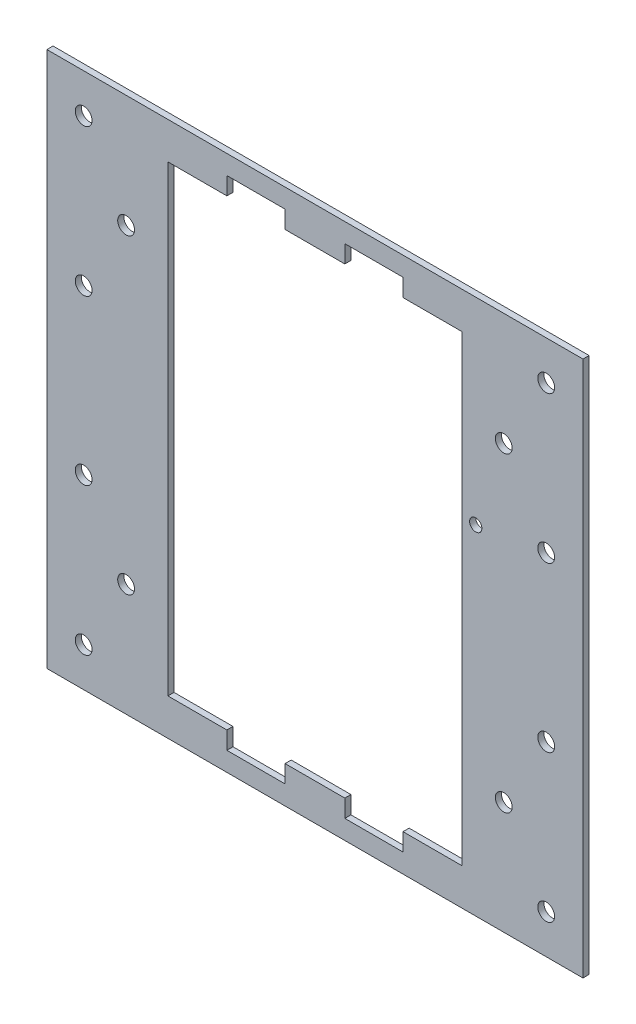
ISO-10303-21;
HEADER;
FILE_DESCRIPTION(('STEP AP214'),'2;1');
FILE_NAME('part.step','',(''),(''),'','','');
FILE_SCHEMA(('AUTOMOTIVE_DESIGN { 1 0 10303 214 1 1 1 1 }'));
ENDSEC;
DATA;
#1=APPLICATION_CONTEXT('core data for automotive mechanical design processes');
#2=APPLICATION_PROTOCOL_DEFINITION('international standard','automotive_design',2000,#1);
#3=PRODUCT_CONTEXT('',#1,'mechanical');
#4=PRODUCT('Part','Part','',(#3));
#5=PRODUCT_RELATED_PRODUCT_CATEGORY('part','',(#4));
#6=PRODUCT_DEFINITION_FORMATION('','',#4);
#7=PRODUCT_DEFINITION_CONTEXT('part definition',#1,'design');
#8=PRODUCT_DEFINITION('design','',#6,#7);
#9=PRODUCT_DEFINITION_SHAPE('','',#8);
#10=(LENGTH_UNIT() NAMED_UNIT(*) SI_UNIT(.MILLI.,.METRE.));
#11=(NAMED_UNIT(*) PLANE_ANGLE_UNIT() SI_UNIT($,.RADIAN.));
#12=(NAMED_UNIT(*) SI_UNIT($,.STERADIAN.) SOLID_ANGLE_UNIT());
#13=UNCERTAINTY_MEASURE_WITH_UNIT(LENGTH_MEASURE(1.E-05),#10,'distance_accuracy_value','');
#14=(GEOMETRIC_REPRESENTATION_CONTEXT(3) GLOBAL_UNCERTAINTY_ASSIGNED_CONTEXT((#13)) GLOBAL_UNIT_ASSIGNED_CONTEXT((#10,
#11,#12)) REPRESENTATION_CONTEXT('',''));
#15=CARTESIAN_POINT('',(0.,0.,0.));
#16=DIRECTION('',(0.,0.,1.));
#17=DIRECTION('',(1.,0.,0.));
#18=AXIS2_PLACEMENT_3D('',#15,#16,#17);
#19=CARTESIAN_POINT('',(0.,700.,8.));
#20=DIRECTION('',(1.,0.,0.));
#21=DIRECTION('',(0.,0.,-1.));
#22=AXIS2_PLACEMENT_3D('',#19,#20,#21);
#23=PLANE('',#22);
#24=DIRECTION('',(0.,-1.,0.));
#25=VECTOR('',#24,1.);
#26=CARTESIAN_POINT('',(0.,700.,0.));
#27=LINE('',#26,#25);
#28=CARTESIAN_POINT('',(0.,700.,0.));
#29=VERTEX_POINT('',#28);
#30=CARTESIAN_POINT('',(0.,0.,0.));
#31=VERTEX_POINT('',#30);
#32=EDGE_CURVE('E422',#29,#31,#27,.T.);
#33=ORIENTED_EDGE('',*,*,#32,.T.);
#34=DIRECTION('',(0.,0.,-1.));
#35=VECTOR('',#34,1.);
#36=CARTESIAN_POINT('',(0.,0.,8.));
#37=LINE('',#36,#35);
#38=CARTESIAN_POINT('',(0.,0.,8.));
#39=VERTEX_POINT('',#38);
#40=EDGE_CURVE('E451',#39,#31,#37,.T.);
#41=ORIENTED_EDGE('',*,*,#40,.F.);
#42=DIRECTION('',(0.,-1.,0.));
#43=VECTOR('',#42,1.);
#44=CARTESIAN_POINT('',(0.,700.,8.));
#45=LINE('',#44,#43);
#46=CARTESIAN_POINT('',(0.,700.,8.));
#47=VERTEX_POINT('',#46);
#48=EDGE_CURVE('E425',#47,#39,#45,.T.);
#49=ORIENTED_EDGE('',*,*,#48,.F.);
#50=DIRECTION('',(0.,0.,-1.));
#51=VECTOR('',#50,1.);
#52=CARTESIAN_POINT('',(0.,700.,8.));
#53=LINE('',#52,#51);
#54=EDGE_CURVE('E435',#47,#29,#53,.T.);
#55=ORIENTED_EDGE('',*,*,#54,.T.);
#56=EDGE_LOOP('',(#33,#41,#49,#55));
#57=FACE_BOUND('',#56,.T.);
#58=ADVANCED_FACE('F39',(#57),#23,.F.);
#59=CARTESIAN_POINT('',(0.,0.,8.));
#60=DIRECTION('',(0.,1.,0.));
#61=DIRECTION('',(0.,0.,1.));
#62=AXIS2_PLACEMENT_3D('',#59,#60,#61);
#63=PLANE('',#62);
#64=DIRECTION('',(1.,0.,0.));
#65=VECTOR('',#64,1.);
#66=CARTESIAN_POINT('',(0.,0.,0.));
#67=LINE('',#66,#65);
#68=CARTESIAN_POINT('',(700.,0.,0.));
#69=VERTEX_POINT('',#68);
#70=EDGE_CURVE('E438',#31,#69,#67,.T.);
#71=ORIENTED_EDGE('',*,*,#70,.T.);
#72=DIRECTION('',(0.,0.,-1.));
#73=VECTOR('',#72,1.);
#74=CARTESIAN_POINT('',(700.,0.,8.));
#75=LINE('',#74,#73);
#76=CARTESIAN_POINT('',(700.,0.,8.));
#77=VERTEX_POINT('',#76);
#78=EDGE_CURVE('E448',#77,#69,#75,.T.);
#79=ORIENTED_EDGE('',*,*,#78,.F.);
#80=DIRECTION('',(1.,0.,0.));
#81=VECTOR('',#80,1.);
#82=CARTESIAN_POINT('',(0.,0.,8.));
#83=LINE('',#82,#81);
#84=EDGE_CURVE('E428',#39,#77,#83,.T.);
#85=ORIENTED_EDGE('',*,*,#84,.F.);
#86=ORIENTED_EDGE('',*,*,#40,.T.);
#87=EDGE_LOOP('',(#71,#79,#85,#86));
#88=FACE_BOUND('',#87,.T.);
#89=ADVANCED_FACE('F519',(#88),#63,.F.);
#90=CARTESIAN_POINT('',(700.,0.,8.));
#91=DIRECTION('',(-1.,0.,0.));
#92=DIRECTION('',(0.,0.,1.));
#93=AXIS2_PLACEMENT_3D('',#90,#91,#92);
#94=PLANE('',#93);
#95=DIRECTION('',(0.,1.,0.));
#96=VECTOR('',#95,1.);
#97=CARTESIAN_POINT('',(700.,0.,0.));
#98=LINE('',#97,#96);
#99=CARTESIAN_POINT('',(700.,700.,0.));
#100=VERTEX_POINT('',#99);
#101=EDGE_CURVE('E440',#69,#100,#98,.T.);
#102=ORIENTED_EDGE('',*,*,#101,.T.);
#103=DIRECTION('',(0.,0.,-1.));
#104=VECTOR('',#103,1.);
#105=CARTESIAN_POINT('',(700.,700.,8.));
#106=LINE('',#105,#104);
#107=CARTESIAN_POINT('',(700.,700.,8.));
#108=VERTEX_POINT('',#107);
#109=EDGE_CURVE('E445',#108,#100,#106,.T.);
#110=ORIENTED_EDGE('',*,*,#109,.F.);
#111=DIRECTION('',(0.,1.,0.));
#112=VECTOR('',#111,1.);
#113=CARTESIAN_POINT('',(700.,0.,8.));
#114=LINE('',#113,#112);
#115=EDGE_CURVE('E431',#77,#108,#114,.T.);
#116=ORIENTED_EDGE('',*,*,#115,.F.);
#117=ORIENTED_EDGE('',*,*,#78,.T.);
#118=EDGE_LOOP('',(#102,#110,#116,#117));
#119=FACE_BOUND('',#118,.T.);
#120=ADVANCED_FACE('F524',(#119),#94,.F.);
#121=CARTESIAN_POINT('',(700.,700.,8.));
#122=DIRECTION('',(0.,-1.,0.));
#123=DIRECTION('',(0.,0.,-1.));
#124=AXIS2_PLACEMENT_3D('',#121,#122,#123);
#125=PLANE('',#124);
#126=DIRECTION('',(-1.,0.,0.));
#127=VECTOR('',#126,1.);
#128=CARTESIAN_POINT('',(700.,700.,0.));
#129=LINE('',#128,#127);
#130=EDGE_CURVE('E429',#100,#29,#129,.T.);
#131=ORIENTED_EDGE('',*,*,#130,.T.);
#132=ORIENTED_EDGE('',*,*,#54,.F.);
#133=DIRECTION('',(-1.,0.,0.));
#134=VECTOR('',#133,1.);
#135=CARTESIAN_POINT('',(700.,700.,8.));
#136=LINE('',#135,#134);
#137=EDGE_CURVE('E433',#108,#47,#136,.T.);
#138=ORIENTED_EDGE('',*,*,#137,.F.);
#139=ORIENTED_EDGE('',*,*,#109,.T.);
#140=EDGE_LOOP('',(#131,#132,#138,#139));
#141=FACE_BOUND('',#140,.T.);
#142=ADVANCED_FACE('F538',(#141),#125,.F.);
#143=CARTESIAN_POINT('',(0.,0.,8.));
#144=DIRECTION('',(0.,0.,1.));
#145=DIRECTION('',(1.,0.,0.));
#146=AXIS2_PLACEMENT_3D('',#143,#144,#145);
#147=PLANE('',#146);
#148=CARTESIAN_POINT('',(560.,442.45,8.));
#149=DIRECTION('',(0.,0.,1.));
#150=DIRECTION('',(1.,0.,0.));
#151=AXIS2_PLACEMENT_3D('',#148,#149,#150);
#152=CIRCLE('',#151,8.00000000000001);
#153=CARTESIAN_POINT('',(568.,442.45,8.));
#154=VERTEX_POINT('',#153);
#155=EDGE_CURVE('E234',#154,#154,#152,.T.);
#156=ORIENTED_EDGE('',*,*,#155,.F.);
#157=EDGE_LOOP('',(#156));
#158=FACE_BOUND('',#157,.T.);
#159=DIRECTION('',(-1.,0.,0.));
#160=VECTOR('',#159,1.);
#161=CARTESIAN_POINT('',(542.,652.,8.));
#162=LINE('',#161,#160);
#163=CARTESIAN_POINT('',(389.,652.,8.));
#164=VERTEX_POINT('',#163);
#165=CARTESIAN_POINT('',(311.,652.,8.));
#166=VERTEX_POINT('',#165);
#167=EDGE_CURVE('E230',#164,#166,#162,.T.);
#168=ORIENTED_EDGE('',*,*,#167,.F.);
#169=DIRECTION('',(0.,-1.,0.));
#170=VECTOR('',#169,1.);
#171=CARTESIAN_POINT('',(389.,675.,8.));
#172=LINE('',#171,#170);
#173=CARTESIAN_POINT('',(389.,675.,8.));
#174=VERTEX_POINT('',#173);
#175=EDGE_CURVE('E340',#174,#164,#172,.T.);
#176=ORIENTED_EDGE('',*,*,#175,.F.);
#177=DIRECTION('',(-1.,0.,0.));
#178=VECTOR('',#177,1.);
#179=CARTESIAN_POINT('',(465.,675.,8.));
#180=LINE('',#179,#178);
#181=CARTESIAN_POINT('',(465.,675.,8.));
#182=VERTEX_POINT('',#181);
#183=EDGE_CURVE('E346',#182,#174,#180,.T.);
#184=ORIENTED_EDGE('',*,*,#183,.F.);
#185=DIRECTION('',(0.,1.,0.));
#186=VECTOR('',#185,1.);
#187=CARTESIAN_POINT('',(465.,375.,8.));
#188=LINE('',#187,#186);
#189=CARTESIAN_POINT('',(465.,652.,8.));
#190=VERTEX_POINT('',#189);
#191=EDGE_CURVE('E354',#190,#182,#188,.T.);
#192=ORIENTED_EDGE('',*,*,#191,.F.);
#193=CARTESIAN_POINT('',(542.,652.,8.));
#194=VERTEX_POINT('',#193);
#195=EDGE_CURVE('E227',#194,#190,#162,.T.);
#196=ORIENTED_EDGE('',*,*,#195,.F.);
#197=DIRECTION('',(0.,1.,0.));
#198=VECTOR('',#197,1.);
#199=CARTESIAN_POINT('',(542.,48.,8.));
#200=LINE('',#199,#198);
#201=CARTESIAN_POINT('',(542.,48.,8.));
#202=VERTEX_POINT('',#201);
#203=EDGE_CURVE('E247',#202,#194,#200,.T.);
#204=ORIENTED_EDGE('',*,*,#203,.F.);
#205=DIRECTION('',(1.,0.,0.));
#206=VECTOR('',#205,1.);
#207=CARTESIAN_POINT('',(158.,48.,8.));
#208=LINE('',#207,#206);
#209=CARTESIAN_POINT('',(465.,48.,8.));
#210=VERTEX_POINT('',#209);
#211=EDGE_CURVE('E243',#210,#202,#208,.T.);
#212=ORIENTED_EDGE('',*,*,#211,.F.);
#213=DIRECTION('',(0.,1.,0.));
#214=VECTOR('',#213,1.);
#215=CARTESIAN_POINT('',(465.,25.,8.));
#216=LINE('',#215,#214);
#217=CARTESIAN_POINT('',(465.,25.,8.));
#218=VERTEX_POINT('',#217);
#219=EDGE_CURVE('E366',#218,#210,#216,.T.);
#220=ORIENTED_EDGE('',*,*,#219,.F.);
#221=DIRECTION('',(1.,0.,0.));
#222=VECTOR('',#221,1.);
#223=CARTESIAN_POINT('',(389.,25.,8.));
#224=LINE('',#223,#222);
#225=CARTESIAN_POINT('',(389.,25.,8.));
#226=VERTEX_POINT('',#225);
#227=EDGE_CURVE('E374',#226,#218,#224,.T.);
#228=ORIENTED_EDGE('',*,*,#227,.F.);
#229=DIRECTION('',(0.,-1.,0.));
#230=VECTOR('',#229,1.);
#231=CARTESIAN_POINT('',(389.,325.,8.));
#232=LINE('',#231,#230);
#233=CARTESIAN_POINT('',(389.,48.,8.));
#234=VERTEX_POINT('',#233);
#235=EDGE_CURVE('E360',#234,#226,#232,.T.);
#236=ORIENTED_EDGE('',*,*,#235,.F.);
#237=CARTESIAN_POINT('',(311.,48.,8.));
#238=VERTEX_POINT('',#237);
#239=EDGE_CURVE('E61',#238,#234,#208,.T.);
#240=ORIENTED_EDGE('',*,*,#239,.F.);
#241=DIRECTION('',(0.,1.,0.));
#242=VECTOR('',#241,1.);
#243=CARTESIAN_POINT('',(311.,25.,8.));
#244=LINE('',#243,#242);
#245=CARTESIAN_POINT('',(311.,25.,8.));
#246=VERTEX_POINT('',#245);
#247=EDGE_CURVE('E407',#246,#238,#244,.T.);
#248=ORIENTED_EDGE('',*,*,#247,.F.);
#249=DIRECTION('',(1.,0.,0.));
#250=VECTOR('',#249,1.);
#251=CARTESIAN_POINT('',(235.,25.,8.));
#252=LINE('',#251,#250);
#253=CARTESIAN_POINT('',(235.,25.,8.));
#254=VERTEX_POINT('',#253);
#255=EDGE_CURVE('E415',#254,#246,#252,.T.);
#256=ORIENTED_EDGE('',*,*,#255,.F.);
#257=DIRECTION('',(0.,-1.,0.));
#258=VECTOR('',#257,1.);
#259=CARTESIAN_POINT('',(235.,325.,8.));
#260=LINE('',#259,#258);
#261=CARTESIAN_POINT('',(235.,48.,8.));
#262=VERTEX_POINT('',#261);
#263=EDGE_CURVE('E401',#262,#254,#260,.T.);
#264=ORIENTED_EDGE('',*,*,#263,.F.);
#265=CARTESIAN_POINT('',(158.,48.,8.));
#266=VERTEX_POINT('',#265);
#267=EDGE_CURVE('E245',#266,#262,#208,.T.);
#268=ORIENTED_EDGE('',*,*,#267,.F.);
#269=DIRECTION('',(0.,-1.,0.));
#270=VECTOR('',#269,1.);
#271=CARTESIAN_POINT('',(158.,652.,8.));
#272=LINE('',#271,#270);
#273=CARTESIAN_POINT('',(158.,652.,8.));
#274=VERTEX_POINT('',#273);
#275=EDGE_CURVE('E206',#274,#266,#272,.T.);
#276=ORIENTED_EDGE('',*,*,#275,.F.);
#277=CARTESIAN_POINT('',(235.,652.,8.));
#278=VERTEX_POINT('',#277);
#279=EDGE_CURVE('E232',#278,#274,#162,.T.);
#280=ORIENTED_EDGE('',*,*,#279,.F.);
#281=DIRECTION('',(0.,-1.,0.));
#282=VECTOR('',#281,1.);
#283=CARTESIAN_POINT('',(235.,675.,8.));
#284=LINE('',#283,#282);
#285=CARTESIAN_POINT('',(235.,675.,8.));
#286=VERTEX_POINT('',#285);
#287=EDGE_CURVE('E381',#286,#278,#284,.T.);
#288=ORIENTED_EDGE('',*,*,#287,.F.);
#289=DIRECTION('',(-1.,0.,0.));
#290=VECTOR('',#289,1.);
#291=CARTESIAN_POINT('',(311.,675.,8.));
#292=LINE('',#291,#290);
#293=CARTESIAN_POINT('',(311.,675.,8.));
#294=VERTEX_POINT('',#293);
#295=EDGE_CURVE('E387',#294,#286,#292,.T.);
#296=ORIENTED_EDGE('',*,*,#295,.F.);
#297=DIRECTION('',(0.,1.,0.));
#298=VECTOR('',#297,1.);
#299=CARTESIAN_POINT('',(311.,375.,8.));
#300=LINE('',#299,#298);
#301=EDGE_CURVE('E395',#166,#294,#300,.T.);
#302=ORIENTED_EDGE('',*,*,#301,.F.);
#303=EDGE_LOOP('',(#168,#176,#184,#192,#196,#204,#212,#220,#228,#236,#240,#248,#256,#264,#268,
#276,#280,#288,#296,#302));
#304=FACE_BOUND('',#303,.T.);
#305=CARTESIAN_POINT('',(596.57,553.,8.));
#306=DIRECTION('',(0.,0.,1.));
#307=DIRECTION('',(1.,0.,0.));
#308=AXIS2_PLACEMENT_3D('',#305,#306,#307);
#309=CIRCLE('',#308,11.);
#310=CARTESIAN_POINT('',(607.57,553.,8.));
#311=VERTEX_POINT('',#310);
#312=EDGE_CURVE('E270',#311,#311,#309,.T.);
#313=ORIENTED_EDGE('',*,*,#312,.F.);
#314=EDGE_LOOP('',(#313));
#315=FACE_BOUND('',#314,.T.);
#316=CARTESIAN_POINT('',(596.57,147.,8.));
#317=DIRECTION('',(0.,0.,1.));
#318=DIRECTION('',(1.,0.,0.));
#319=AXIS2_PLACEMENT_3D('',#316,#317,#318);
#320=CIRCLE('',#319,11.);
#321=CARTESIAN_POINT('',(607.57,147.,8.));
#322=VERTEX_POINT('',#321);
#323=EDGE_CURVE('E274',#322,#322,#320,.T.);
#324=ORIENTED_EDGE('',*,*,#323,.F.);
#325=EDGE_LOOP('',(#324));
#326=FACE_BOUND('',#325,.T.);
#327=CARTESIAN_POINT('',(652.,649.,8.));
#328=DIRECTION('',(0.,0.,1.));
#329=DIRECTION('',(1.,0.,0.));
#330=AXIS2_PLACEMENT_3D('',#327,#328,#329);
#331=CIRCLE('',#330,11.);
#332=CARTESIAN_POINT('',(663.,649.,8.));
#333=VERTEX_POINT('',#332);
#334=EDGE_CURVE('E280',#333,#333,#331,.T.);
#335=ORIENTED_EDGE('',*,*,#334,.F.);
#336=EDGE_LOOP('',(#335));
#337=FACE_BOUND('',#336,.T.);
#338=CARTESIAN_POINT('',(652.,457.,8.));
#339=DIRECTION('',(0.,0.,1.));
#340=DIRECTION('',(1.,0.,0.));
#341=AXIS2_PLACEMENT_3D('',#338,#339,#340);
#342=CIRCLE('',#341,11.);
#343=CARTESIAN_POINT('',(663.,457.,8.));
#344=VERTEX_POINT('',#343);
#345=EDGE_CURVE('E286',#344,#344,#342,.T.);
#346=ORIENTED_EDGE('',*,*,#345,.F.);
#347=EDGE_LOOP('',(#346));
#348=FACE_BOUND('',#347,.T.);
#349=CARTESIAN_POINT('',(652.,243.,8.));
#350=DIRECTION('',(0.,0.,1.));
#351=DIRECTION('',(1.,0.,0.));
#352=AXIS2_PLACEMENT_3D('',#349,#350,#351);
#353=CIRCLE('',#352,11.);
#354=CARTESIAN_POINT('',(663.,243.,8.));
#355=VERTEX_POINT('',#354);
#356=EDGE_CURVE('E292',#355,#355,#353,.T.);
#357=ORIENTED_EDGE('',*,*,#356,.F.);
#358=EDGE_LOOP('',(#357));
#359=FACE_BOUND('',#358,.T.);
#360=CARTESIAN_POINT('',(652.,51.,8.));
#361=DIRECTION('',(0.,0.,1.));
#362=DIRECTION('',(1.,0.,0.));
#363=AXIS2_PLACEMENT_3D('',#360,#361,#362);
#364=CIRCLE('',#363,11.);
#365=CARTESIAN_POINT('',(663.,51.,8.));
#366=VERTEX_POINT('',#365);
#367=EDGE_CURVE('E298',#366,#366,#364,.T.);
#368=ORIENTED_EDGE('',*,*,#367,.F.);
#369=EDGE_LOOP('',(#368));
#370=FACE_BOUND('',#369,.T.);
#371=CARTESIAN_POINT('',(103.43,553.,8.));
#372=DIRECTION('',(0.,0.,1.));
#373=DIRECTION('',(1.,0.,0.));
#374=AXIS2_PLACEMENT_3D('',#371,#372,#373);
#375=CIRCLE('',#374,11.);
#376=CARTESIAN_POINT('',(114.43,553.,8.));
#377=VERTEX_POINT('',#376);
#378=EDGE_CURVE('E304',#377,#377,#375,.T.);
#379=ORIENTED_EDGE('',*,*,#378,.F.);
#380=EDGE_LOOP('',(#379));
#381=FACE_BOUND('',#380,.T.);
#382=CARTESIAN_POINT('',(103.43,147.,8.));
#383=DIRECTION('',(0.,0.,1.));
#384=DIRECTION('',(1.,0.,0.));
#385=AXIS2_PLACEMENT_3D('',#382,#383,#384);
#386=CIRCLE('',#385,11.);
#387=CARTESIAN_POINT('',(114.43,147.,8.));
#388=VERTEX_POINT('',#387);
#389=EDGE_CURVE('E310',#388,#388,#386,.T.);
#390=ORIENTED_EDGE('',*,*,#389,.F.);
#391=EDGE_LOOP('',(#390));
#392=FACE_BOUND('',#391,.T.);
#393=CARTESIAN_POINT('',(48.,649.,8.));
#394=DIRECTION('',(0.,0.,1.));
#395=DIRECTION('',(1.,0.,0.));
#396=AXIS2_PLACEMENT_3D('',#393,#394,#395);
#397=CIRCLE('',#396,11.);
#398=CARTESIAN_POINT('',(59.,649.,8.));
#399=VERTEX_POINT('',#398);
#400=EDGE_CURVE('E316',#399,#399,#397,.T.);
#401=ORIENTED_EDGE('',*,*,#400,.F.);
#402=EDGE_LOOP('',(#401));
#403=FACE_BOUND('',#402,.T.);
#404=CARTESIAN_POINT('',(48.,457.,8.));
#405=DIRECTION('',(0.,0.,1.));
#406=DIRECTION('',(1.,0.,0.));
#407=AXIS2_PLACEMENT_3D('',#404,#405,#406);
#408=CIRCLE('',#407,11.);
#409=CARTESIAN_POINT('',(59.,457.,8.));
#410=VERTEX_POINT('',#409);
#411=EDGE_CURVE('E322',#410,#410,#408,.T.);
#412=ORIENTED_EDGE('',*,*,#411,.F.);
#413=EDGE_LOOP('',(#412));
#414=FACE_BOUND('',#413,.T.);
#415=CARTESIAN_POINT('',(48.,243.,8.));
#416=DIRECTION('',(0.,0.,1.));
#417=DIRECTION('',(1.,0.,0.));
#418=AXIS2_PLACEMENT_3D('',#415,#416,#417);
#419=CIRCLE('',#418,11.);
#420=CARTESIAN_POINT('',(59.,243.,8.));
#421=VERTEX_POINT('',#420);
#422=EDGE_CURVE('E328',#421,#421,#419,.T.);
#423=ORIENTED_EDGE('',*,*,#422,.F.);
#424=EDGE_LOOP('',(#423));
#425=FACE_BOUND('',#424,.T.);
#426=CARTESIAN_POINT('',(48.,51.,8.));
#427=DIRECTION('',(0.,0.,1.));
#428=DIRECTION('',(1.,0.,0.));
#429=AXIS2_PLACEMENT_3D('',#426,#427,#428);
#430=CIRCLE('',#429,11.);
#431=CARTESIAN_POINT('',(59.,51.,8.));
#432=VERTEX_POINT('',#431);
#433=EDGE_CURVE('E334',#432,#432,#430,.T.);
#434=ORIENTED_EDGE('',*,*,#433,.F.);
#435=EDGE_LOOP('',(#434));
#436=FACE_BOUND('',#435,.T.);
#437=ORIENTED_EDGE('',*,*,#48,.T.);
#438=ORIENTED_EDGE('',*,*,#84,.T.);
#439=ORIENTED_EDGE('',*,*,#115,.T.);
#440=ORIENTED_EDGE('',*,*,#137,.T.);
#441=EDGE_LOOP('',(#437,#438,#439,#440));
#442=FACE_BOUND('',#441,.T.);
#443=ADVANCED_FACE('F465',(#158,#304,#315,#326,#337,#348,#359,#370,#381,#392,#403,#414,#425,
#436,#442),#147,.T.);
#444=CARTESIAN_POINT('',(0.,0.,0.));
#445=DIRECTION('',(0.,0.,1.));
#446=DIRECTION('',(1.,0.,0.));
#447=AXIS2_PLACEMENT_3D('',#444,#445,#446);
#448=PLANE('',#447);
#449=CARTESIAN_POINT('',(560.,442.45,0.));
#450=DIRECTION('',(0.,0.,1.));
#451=DIRECTION('',(1.,0.,0.));
#452=AXIS2_PLACEMENT_3D('',#449,#450,#451);
#453=CIRCLE('',#452,8.00000000000001);
#454=CARTESIAN_POINT('',(568.,442.45,0.));
#455=VERTEX_POINT('',#454);
#456=EDGE_CURVE('E244',#455,#455,#453,.T.);
#457=ORIENTED_EDGE('',*,*,#456,.T.);
#458=EDGE_LOOP('',(#457));
#459=FACE_BOUND('',#458,.T.);
#460=CARTESIAN_POINT('',(596.57,553.,0.));
#461=DIRECTION('',(0.,0.,1.));
#462=DIRECTION('',(1.,0.,0.));
#463=AXIS2_PLACEMENT_3D('',#460,#461,#462);
#464=CIRCLE('',#463,11.);
#465=CARTESIAN_POINT('',(607.57,553.,0.));
#466=VERTEX_POINT('',#465);
#467=EDGE_CURVE('E271',#466,#466,#464,.T.);
#468=ORIENTED_EDGE('',*,*,#467,.T.);
#469=EDGE_LOOP('',(#468));
#470=FACE_BOUND('',#469,.T.);
#471=CARTESIAN_POINT('',(596.57,147.,0.));
#472=DIRECTION('',(0.,0.,1.));
#473=DIRECTION('',(1.,0.,0.));
#474=AXIS2_PLACEMENT_3D('',#471,#472,#473);
#475=CIRCLE('',#474,11.);
#476=CARTESIAN_POINT('',(607.57,147.,0.));
#477=VERTEX_POINT('',#476);
#478=EDGE_CURVE('E277',#477,#477,#475,.T.);
#479=ORIENTED_EDGE('',*,*,#478,.T.);
#480=EDGE_LOOP('',(#479));
#481=FACE_BOUND('',#480,.T.);
#482=CARTESIAN_POINT('',(652.,649.,0.));
#483=DIRECTION('',(0.,0.,1.));
#484=DIRECTION('',(1.,0.,0.));
#485=AXIS2_PLACEMENT_3D('',#482,#483,#484);
#486=CIRCLE('',#485,11.);
#487=CARTESIAN_POINT('',(663.,649.,0.));
#488=VERTEX_POINT('',#487);
#489=EDGE_CURVE('E283',#488,#488,#486,.T.);
#490=ORIENTED_EDGE('',*,*,#489,.T.);
#491=EDGE_LOOP('',(#490));
#492=FACE_BOUND('',#491,.T.);
#493=CARTESIAN_POINT('',(652.,457.,0.));
#494=DIRECTION('',(0.,0.,1.));
#495=DIRECTION('',(1.,0.,0.));
#496=AXIS2_PLACEMENT_3D('',#493,#494,#495);
#497=CIRCLE('',#496,11.);
#498=CARTESIAN_POINT('',(663.,457.,0.));
#499=VERTEX_POINT('',#498);
#500=EDGE_CURVE('E289',#499,#499,#497,.T.);
#501=ORIENTED_EDGE('',*,*,#500,.T.);
#502=EDGE_LOOP('',(#501));
#503=FACE_BOUND('',#502,.T.);
#504=CARTESIAN_POINT('',(652.,243.,0.));
#505=DIRECTION('',(0.,0.,1.));
#506=DIRECTION('',(1.,0.,0.));
#507=AXIS2_PLACEMENT_3D('',#504,#505,#506);
#508=CIRCLE('',#507,11.);
#509=CARTESIAN_POINT('',(663.,243.,0.));
#510=VERTEX_POINT('',#509);
#511=EDGE_CURVE('E295',#510,#510,#508,.T.);
#512=ORIENTED_EDGE('',*,*,#511,.T.);
#513=EDGE_LOOP('',(#512));
#514=FACE_BOUND('',#513,.T.);
#515=CARTESIAN_POINT('',(652.,51.,0.));
#516=DIRECTION('',(0.,0.,1.));
#517=DIRECTION('',(1.,0.,0.));
#518=AXIS2_PLACEMENT_3D('',#515,#516,#517);
#519=CIRCLE('',#518,11.);
#520=CARTESIAN_POINT('',(663.,51.,0.));
#521=VERTEX_POINT('',#520);
#522=EDGE_CURVE('E301',#521,#521,#519,.T.);
#523=ORIENTED_EDGE('',*,*,#522,.T.);
#524=EDGE_LOOP('',(#523));
#525=FACE_BOUND('',#524,.T.);
#526=CARTESIAN_POINT('',(103.43,553.,0.));
#527=DIRECTION('',(0.,0.,1.));
#528=DIRECTION('',(1.,0.,0.));
#529=AXIS2_PLACEMENT_3D('',#526,#527,#528);
#530=CIRCLE('',#529,11.);
#531=CARTESIAN_POINT('',(114.43,553.,0.));
#532=VERTEX_POINT('',#531);
#533=EDGE_CURVE('E307',#532,#532,#530,.T.);
#534=ORIENTED_EDGE('',*,*,#533,.T.);
#535=EDGE_LOOP('',(#534));
#536=FACE_BOUND('',#535,.T.);
#537=CARTESIAN_POINT('',(103.43,147.,0.));
#538=DIRECTION('',(0.,0.,1.));
#539=DIRECTION('',(1.,0.,0.));
#540=AXIS2_PLACEMENT_3D('',#537,#538,#539);
#541=CIRCLE('',#540,11.);
#542=CARTESIAN_POINT('',(114.43,147.,0.));
#543=VERTEX_POINT('',#542);
#544=EDGE_CURVE('E313',#543,#543,#541,.T.);
#545=ORIENTED_EDGE('',*,*,#544,.T.);
#546=EDGE_LOOP('',(#545));
#547=FACE_BOUND('',#546,.T.);
#548=CARTESIAN_POINT('',(48.,649.,0.));
#549=DIRECTION('',(0.,0.,1.));
#550=DIRECTION('',(1.,0.,0.));
#551=AXIS2_PLACEMENT_3D('',#548,#549,#550);
#552=CIRCLE('',#551,11.);
#553=CARTESIAN_POINT('',(59.,649.,0.));
#554=VERTEX_POINT('',#553);
#555=EDGE_CURVE('E319',#554,#554,#552,.T.);
#556=ORIENTED_EDGE('',*,*,#555,.T.);
#557=EDGE_LOOP('',(#556));
#558=FACE_BOUND('',#557,.T.);
#559=CARTESIAN_POINT('',(48.,457.,0.));
#560=DIRECTION('',(0.,0.,1.));
#561=DIRECTION('',(1.,0.,0.));
#562=AXIS2_PLACEMENT_3D('',#559,#560,#561);
#563=CIRCLE('',#562,11.);
#564=CARTESIAN_POINT('',(59.,457.,0.));
#565=VERTEX_POINT('',#564);
#566=EDGE_CURVE('E325',#565,#565,#563,.T.);
#567=ORIENTED_EDGE('',*,*,#566,.T.);
#568=EDGE_LOOP('',(#567));
#569=FACE_BOUND('',#568,.T.);
#570=CARTESIAN_POINT('',(48.,243.,0.));
#571=DIRECTION('',(0.,0.,1.));
#572=DIRECTION('',(1.,0.,0.));
#573=AXIS2_PLACEMENT_3D('',#570,#571,#572);
#574=CIRCLE('',#573,11.);
#575=CARTESIAN_POINT('',(59.,243.,0.));
#576=VERTEX_POINT('',#575);
#577=EDGE_CURVE('E331',#576,#576,#574,.T.);
#578=ORIENTED_EDGE('',*,*,#577,.T.);
#579=EDGE_LOOP('',(#578));
#580=FACE_BOUND('',#579,.T.);
#581=CARTESIAN_POINT('',(48.,51.,0.));
#582=DIRECTION('',(0.,0.,1.));
#583=DIRECTION('',(1.,0.,0.));
#584=AXIS2_PLACEMENT_3D('',#581,#582,#583);
#585=CIRCLE('',#584,11.);
#586=CARTESIAN_POINT('',(59.,51.,0.));
#587=VERTEX_POINT('',#586);
#588=EDGE_CURVE('E337',#587,#587,#585,.T.);
#589=ORIENTED_EDGE('',*,*,#588,.T.);
#590=EDGE_LOOP('',(#589));
#591=FACE_BOUND('',#590,.T.);
#592=DIRECTION('',(0.,-1.,0.));
#593=VECTOR('',#592,1.);
#594=CARTESIAN_POINT('',(389.,675.,0.));
#595=LINE('',#594,#593);
#596=CARTESIAN_POINT('',(389.,675.,0.));
#597=VERTEX_POINT('',#596);
#598=CARTESIAN_POINT('',(389.,652.,0.));
#599=VERTEX_POINT('',#598);
#600=EDGE_CURVE('E343',#597,#599,#595,.T.);
#601=ORIENTED_EDGE('',*,*,#600,.T.);
#602=DIRECTION('',(-1.,0.,0.));
#603=VECTOR('',#602,1.);
#604=CARTESIAN_POINT('',(542.,652.,0.));
#605=LINE('',#604,#603);
#606=CARTESIAN_POINT('',(311.,652.,0.));
#607=VERTEX_POINT('',#606);
#608=EDGE_CURVE('E241',#599,#607,#605,.T.);
#609=ORIENTED_EDGE('',*,*,#608,.T.);
#610=DIRECTION('',(0.,1.,0.));
#611=VECTOR('',#610,1.);
#612=CARTESIAN_POINT('',(311.,375.,0.));
#613=LINE('',#612,#611);
#614=CARTESIAN_POINT('',(311.,675.,0.));
#615=VERTEX_POINT('',#614);
#616=EDGE_CURVE('E386',#607,#615,#613,.T.);
#617=ORIENTED_EDGE('',*,*,#616,.T.);
#618=DIRECTION('',(-1.,0.,0.));
#619=VECTOR('',#618,1.);
#620=CARTESIAN_POINT('',(311.,675.,0.));
#621=LINE('',#620,#619);
#622=CARTESIAN_POINT('',(235.,675.,0.));
#623=VERTEX_POINT('',#622);
#624=EDGE_CURVE('E389',#615,#623,#621,.T.);
#625=ORIENTED_EDGE('',*,*,#624,.T.);
#626=DIRECTION('',(0.,-1.,0.));
#627=VECTOR('',#626,1.);
#628=CARTESIAN_POINT('',(235.,675.,0.));
#629=LINE('',#628,#627);
#630=CARTESIAN_POINT('',(235.,652.,0.));
#631=VERTEX_POINT('',#630);
#632=EDGE_CURVE('E384',#623,#631,#629,.T.);
#633=ORIENTED_EDGE('',*,*,#632,.T.);
#634=CARTESIAN_POINT('',(158.,652.,0.));
#635=VERTEX_POINT('',#634);
#636=EDGE_CURVE('E53',#631,#635,#605,.T.);
#637=ORIENTED_EDGE('',*,*,#636,.T.);
#638=DIRECTION('',(0.,-1.,0.));
#639=VECTOR('',#638,1.);
#640=CARTESIAN_POINT('',(158.,652.,0.));
#641=LINE('',#640,#639);
#642=CARTESIAN_POINT('',(158.,48.,0.));
#643=VERTEX_POINT('',#642);
#644=EDGE_CURVE('E204',#635,#643,#641,.T.);
#645=ORIENTED_EDGE('',*,*,#644,.T.);
#646=DIRECTION('',(1.,0.,0.));
#647=VECTOR('',#646,1.);
#648=CARTESIAN_POINT('',(158.,48.,0.));
#649=LINE('',#648,#647);
#650=CARTESIAN_POINT('',(235.,48.,0.));
#651=VERTEX_POINT('',#650);
#652=EDGE_CURVE('E213',#643,#651,#649,.T.);
#653=ORIENTED_EDGE('',*,*,#652,.T.);
#654=DIRECTION('',(0.,-1.,0.));
#655=VECTOR('',#654,1.);
#656=CARTESIAN_POINT('',(235.,325.,0.));
#657=LINE('',#656,#655);
#658=CARTESIAN_POINT('',(235.,25.,0.));
#659=VERTEX_POINT('',#658);
#660=EDGE_CURVE('E404',#651,#659,#657,.T.);
#661=ORIENTED_EDGE('',*,*,#660,.T.);
#662=DIRECTION('',(1.,0.,0.));
#663=VECTOR('',#662,1.);
#664=CARTESIAN_POINT('',(235.,25.,0.));
#665=LINE('',#664,#663);
#666=CARTESIAN_POINT('',(311.,25.,0.));
#667=VERTEX_POINT('',#666);
#668=EDGE_CURVE('E406',#659,#667,#665,.T.);
#669=ORIENTED_EDGE('',*,*,#668,.T.);
#670=DIRECTION('',(0.,1.,0.));
#671=VECTOR('',#670,1.);
#672=CARTESIAN_POINT('',(311.,25.,0.));
#673=LINE('',#672,#671);
#674=CARTESIAN_POINT('',(311.,48.,0.));
#675=VERTEX_POINT('',#674);
#676=EDGE_CURVE('E410',#667,#675,#673,.T.);
#677=ORIENTED_EDGE('',*,*,#676,.T.);
#678=CARTESIAN_POINT('',(389.,48.,0.));
#679=VERTEX_POINT('',#678);
#680=EDGE_CURVE('E220',#675,#679,#649,.T.);
#681=ORIENTED_EDGE('',*,*,#680,.T.);
#682=DIRECTION('',(0.,-1.,0.));
#683=VECTOR('',#682,1.);
#684=CARTESIAN_POINT('',(389.,325.,0.));
#685=LINE('',#684,#683);
#686=CARTESIAN_POINT('',(389.,25.,0.));
#687=VERTEX_POINT('',#686);
#688=EDGE_CURVE('E363',#679,#687,#685,.T.);
#689=ORIENTED_EDGE('',*,*,#688,.T.);
#690=DIRECTION('',(1.,0.,0.));
#691=VECTOR('',#690,1.);
#692=CARTESIAN_POINT('',(389.,25.,0.));
#693=LINE('',#692,#691);
#694=CARTESIAN_POINT('',(465.,25.,0.));
#695=VERTEX_POINT('',#694);
#696=EDGE_CURVE('E365',#687,#695,#693,.T.);
#697=ORIENTED_EDGE('',*,*,#696,.T.);
#698=DIRECTION('',(0.,1.,0.));
#699=VECTOR('',#698,1.);
#700=CARTESIAN_POINT('',(465.,25.,0.));
#701=LINE('',#700,#699);
#702=CARTESIAN_POINT('',(465.,48.,0.));
#703=VERTEX_POINT('',#702);
#704=EDGE_CURVE('E369',#695,#703,#701,.T.);
#705=ORIENTED_EDGE('',*,*,#704,.T.);
#706=CARTESIAN_POINT('',(542.,48.,0.));
#707=VERTEX_POINT('',#706);
#708=EDGE_CURVE('E222',#703,#707,#649,.T.);
#709=ORIENTED_EDGE('',*,*,#708,.T.);
#710=DIRECTION('',(0.,1.,0.));
#711=VECTOR('',#710,1.);
#712=CARTESIAN_POINT('',(542.,48.,0.));
#713=LINE('',#712,#711);
#714=CARTESIAN_POINT('',(542.,652.,0.));
#715=VERTEX_POINT('',#714);
#716=EDGE_CURVE('E219',#707,#715,#713,.T.);
#717=ORIENTED_EDGE('',*,*,#716,.T.);
#718=CARTESIAN_POINT('',(465.,652.,0.));
#719=VERTEX_POINT('',#718);
#720=EDGE_CURVE('E210',#715,#719,#605,.T.);
#721=ORIENTED_EDGE('',*,*,#720,.T.);
#722=DIRECTION('',(0.,1.,0.));
#723=VECTOR('',#722,1.);
#724=CARTESIAN_POINT('',(465.,375.,0.));
#725=LINE('',#724,#723);
#726=CARTESIAN_POINT('',(465.,675.,0.));
#727=VERTEX_POINT('',#726);
#728=EDGE_CURVE('E345',#719,#727,#725,.T.);
#729=ORIENTED_EDGE('',*,*,#728,.T.);
#730=DIRECTION('',(-1.,0.,0.));
#731=VECTOR('',#730,1.);
#732=CARTESIAN_POINT('',(465.,675.,0.));
#733=LINE('',#732,#731);
#734=EDGE_CURVE('E348',#727,#597,#733,.T.);
#735=ORIENTED_EDGE('',*,*,#734,.T.);
#736=EDGE_LOOP('',(#601,#609,#617,#625,#633,#637,#645,#653,#661,#669,#677,#681,#689,#697,#705,
#709,#717,#721,#729,#735));
#737=FACE_BOUND('',#736,.T.);
#738=ORIENTED_EDGE('',*,*,#32,.F.);
#739=ORIENTED_EDGE('',*,*,#130,.F.);
#740=ORIENTED_EDGE('',*,*,#101,.F.);
#741=ORIENTED_EDGE('',*,*,#70,.F.);
#742=EDGE_LOOP('',(#738,#739,#740,#741));
#743=FACE_BOUND('',#742,.T.);
#744=ADVANCED_FACE('F224',(#459,#470,#481,#492,#503,#514,#525,#536,#547,#558,#569,#580,#591,
#737,#743),#448,.F.);
#745=CARTESIAN_POINT('',(235.,325.,0.));
#746=DIRECTION('',(-1.,0.,0.));
#747=DIRECTION('',(0.,0.,1.));
#748=AXIS2_PLACEMENT_3D('',#745,#746,#747);
#749=PLANE('',#748);
#750=ORIENTED_EDGE('',*,*,#660,.F.);
#751=DIRECTION('',(0.,0.,1.));
#752=VECTOR('',#751,1.);
#753=CARTESIAN_POINT('',(235.,48.,0.));
#754=LINE('',#753,#752);
#755=EDGE_CURVE('E216',#651,#262,#754,.T.);
#756=ORIENTED_EDGE('',*,*,#755,.T.);
#757=ORIENTED_EDGE('',*,*,#263,.T.);
#758=DIRECTION('',(0.,0.,1.));
#759=VECTOR('',#758,1.);
#760=CARTESIAN_POINT('',(235.,25.,0.));
#761=LINE('',#760,#759);
#762=EDGE_CURVE('E413',#659,#254,#761,.T.);
#763=ORIENTED_EDGE('',*,*,#762,.F.);
#764=EDGE_LOOP('',(#750,#756,#757,#763));
#765=FACE_BOUND('',#764,.T.);
#766=ADVANCED_FACE('F506',(#765),#749,.F.);
#767=CARTESIAN_POINT('',(311.,25.,0.));
#768=DIRECTION('',(1.,0.,0.));
#769=DIRECTION('',(0.,0.,-1.));
#770=AXIS2_PLACEMENT_3D('',#767,#768,#769);
#771=PLANE('',#770);
#772=ORIENTED_EDGE('',*,*,#247,.T.);
#773=DIRECTION('',(0.,0.,-1.));
#774=VECTOR('',#773,1.);
#775=CARTESIAN_POINT('',(311.,48.,0.));
#776=LINE('',#775,#774);
#777=EDGE_CURVE('E266',#238,#675,#776,.T.);
#778=ORIENTED_EDGE('',*,*,#777,.T.);
#779=ORIENTED_EDGE('',*,*,#676,.F.);
#780=DIRECTION('',(0.,0.,1.));
#781=VECTOR('',#780,1.);
#782=CARTESIAN_POINT('',(311.,25.,0.));
#783=LINE('',#782,#781);
#784=EDGE_CURVE('E420',#667,#246,#783,.T.);
#785=ORIENTED_EDGE('',*,*,#784,.T.);
#786=EDGE_LOOP('',(#772,#778,#779,#785));
#787=FACE_BOUND('',#786,.T.);
#788=ADVANCED_FACE('F499',(#787),#771,.F.);
#789=CARTESIAN_POINT('',(235.,25.,0.));
#790=DIRECTION('',(0.,-1.,0.));
#791=DIRECTION('',(0.,0.,-1.));
#792=AXIS2_PLACEMENT_3D('',#789,#790,#791);
#793=PLANE('',#792);
#794=ORIENTED_EDGE('',*,*,#255,.T.);
#795=ORIENTED_EDGE('',*,*,#784,.F.);
#796=ORIENTED_EDGE('',*,*,#668,.F.);
#797=ORIENTED_EDGE('',*,*,#762,.T.);
#798=EDGE_LOOP('',(#794,#795,#796,#797));
#799=FACE_BOUND('',#798,.T.);
#800=ADVANCED_FACE('F501',(#799),#793,.F.);
#801=CARTESIAN_POINT('',(235.,675.,0.));
#802=DIRECTION('',(-1.,0.,0.));
#803=DIRECTION('',(0.,0.,1.));
#804=AXIS2_PLACEMENT_3D('',#801,#802,#803);
#805=PLANE('',#804);
#806=ORIENTED_EDGE('',*,*,#287,.T.);
#807=DIRECTION('',(0.,0.,-1.));
#808=VECTOR('',#807,1.);
#809=CARTESIAN_POINT('',(235.,652.,0.));
#810=LINE('',#809,#808);
#811=EDGE_CURVE('E262',#278,#631,#810,.T.);
#812=ORIENTED_EDGE('',*,*,#811,.T.);
#813=ORIENTED_EDGE('',*,*,#632,.F.);
#814=DIRECTION('',(0.,0.,1.));
#815=VECTOR('',#814,1.);
#816=CARTESIAN_POINT('',(235.,675.,0.));
#817=LINE('',#816,#815);
#818=EDGE_CURVE('E399',#623,#286,#817,.T.);
#819=ORIENTED_EDGE('',*,*,#818,.T.);
#820=EDGE_LOOP('',(#806,#812,#813,#819));
#821=FACE_BOUND('',#820,.T.);
#822=ADVANCED_FACE('F640',(#821),#805,.F.);
#823=CARTESIAN_POINT('',(311.,675.,0.));
#824=DIRECTION('',(0.,1.,0.));
#825=DIRECTION('',(0.,0.,1.));
#826=AXIS2_PLACEMENT_3D('',#823,#824,#825);
#827=PLANE('',#826);
#828=ORIENTED_EDGE('',*,*,#295,.T.);
#829=ORIENTED_EDGE('',*,*,#818,.F.);
#830=ORIENTED_EDGE('',*,*,#624,.F.);
#831=DIRECTION('',(0.,0.,1.));
#832=VECTOR('',#831,1.);
#833=CARTESIAN_POINT('',(311.,675.,0.));
#834=LINE('',#833,#832);
#835=EDGE_CURVE('E392',#615,#294,#834,.T.);
#836=ORIENTED_EDGE('',*,*,#835,.T.);
#837=EDGE_LOOP('',(#828,#829,#830,#836));
#838=FACE_BOUND('',#837,.T.);
#839=ADVANCED_FACE('F637',(#838),#827,.F.);
#840=CARTESIAN_POINT('',(311.,375.,0.));
#841=DIRECTION('',(1.,0.,0.));
#842=DIRECTION('',(0.,0.,-1.));
#843=AXIS2_PLACEMENT_3D('',#840,#841,#842);
#844=PLANE('',#843);
#845=ORIENTED_EDGE('',*,*,#616,.F.);
#846=DIRECTION('',(0.,0.,1.));
#847=VECTOR('',#846,1.);
#848=CARTESIAN_POINT('',(311.,652.,0.));
#849=LINE('',#848,#847);
#850=EDGE_CURVE('E259',#607,#166,#849,.T.);
#851=ORIENTED_EDGE('',*,*,#850,.T.);
#852=ORIENTED_EDGE('',*,*,#301,.T.);
#853=ORIENTED_EDGE('',*,*,#835,.F.);
#854=EDGE_LOOP('',(#845,#851,#852,#853));
#855=FACE_BOUND('',#854,.T.);
#856=ADVANCED_FACE('F636',(#855),#844,.F.);
#857=CARTESIAN_POINT('',(389.,325.,0.));
#858=DIRECTION('',(-1.,0.,0.));
#859=DIRECTION('',(0.,0.,1.));
#860=AXIS2_PLACEMENT_3D('',#857,#858,#859);
#861=PLANE('',#860);
#862=ORIENTED_EDGE('',*,*,#688,.F.);
#863=DIRECTION('',(0.,0.,1.));
#864=VECTOR('',#863,1.);
#865=CARTESIAN_POINT('',(389.,48.,0.));
#866=LINE('',#865,#864);
#867=EDGE_CURVE('E264',#679,#234,#866,.T.);
#868=ORIENTED_EDGE('',*,*,#867,.T.);
#869=ORIENTED_EDGE('',*,*,#235,.T.);
#870=DIRECTION('',(0.,0.,1.));
#871=VECTOR('',#870,1.);
#872=CARTESIAN_POINT('',(389.,25.,0.));
#873=LINE('',#872,#871);
#874=EDGE_CURVE('E372',#687,#226,#873,.T.);
#875=ORIENTED_EDGE('',*,*,#874,.F.);
#876=EDGE_LOOP('',(#862,#868,#869,#875));
#877=FACE_BOUND('',#876,.T.);
#878=ADVANCED_FACE('F493',(#877),#861,.F.);
#879=CARTESIAN_POINT('',(465.,25.,0.));
#880=DIRECTION('',(1.,0.,0.));
#881=DIRECTION('',(0.,0.,-1.));
#882=AXIS2_PLACEMENT_3D('',#879,#880,#881);
#883=PLANE('',#882);
#884=ORIENTED_EDGE('',*,*,#219,.T.);
#885=DIRECTION('',(0.,0.,-1.));
#886=VECTOR('',#885,1.);
#887=CARTESIAN_POINT('',(465.,48.,0.));
#888=LINE('',#887,#886);
#889=EDGE_CURVE('E11',#210,#703,#888,.T.);
#890=ORIENTED_EDGE('',*,*,#889,.T.);
#891=ORIENTED_EDGE('',*,*,#704,.F.);
#892=DIRECTION('',(0.,0.,1.));
#893=VECTOR('',#892,1.);
#894=CARTESIAN_POINT('',(465.,25.,0.));
#895=LINE('',#894,#893);
#896=EDGE_CURVE('E379',#695,#218,#895,.T.);
#897=ORIENTED_EDGE('',*,*,#896,.T.);
#898=EDGE_LOOP('',(#884,#890,#891,#897));
#899=FACE_BOUND('',#898,.T.);
#900=ADVANCED_FACE('F483',(#899),#883,.F.);
#901=CARTESIAN_POINT('',(389.,25.,0.));
#902=DIRECTION('',(0.,-1.,0.));
#903=DIRECTION('',(0.,0.,-1.));
#904=AXIS2_PLACEMENT_3D('',#901,#902,#903);
#905=PLANE('',#904);
#906=ORIENTED_EDGE('',*,*,#227,.T.);
#907=ORIENTED_EDGE('',*,*,#896,.F.);
#908=ORIENTED_EDGE('',*,*,#696,.F.);
#909=ORIENTED_EDGE('',*,*,#874,.T.);
#910=EDGE_LOOP('',(#906,#907,#908,#909));
#911=FACE_BOUND('',#910,.T.);
#912=ADVANCED_FACE('F487',(#911),#905,.F.);
#913=CARTESIAN_POINT('',(389.,675.,0.));
#914=DIRECTION('',(-1.,0.,0.));
#915=DIRECTION('',(0.,0.,1.));
#916=AXIS2_PLACEMENT_3D('',#913,#914,#915);
#917=PLANE('',#916);
#918=ORIENTED_EDGE('',*,*,#175,.T.);
#919=DIRECTION('',(0.,0.,-1.));
#920=VECTOR('',#919,1.);
#921=CARTESIAN_POINT('',(389.,652.,0.));
#922=LINE('',#921,#920);
#923=EDGE_CURVE('E252',#164,#599,#922,.T.);
#924=ORIENTED_EDGE('',*,*,#923,.T.);
#925=ORIENTED_EDGE('',*,*,#600,.F.);
#926=DIRECTION('',(0.,0.,1.));
#927=VECTOR('',#926,1.);
#928=CARTESIAN_POINT('',(389.,675.,0.));
#929=LINE('',#928,#927);
#930=EDGE_CURVE('E358',#597,#174,#929,.T.);
#931=ORIENTED_EDGE('',*,*,#930,.T.);
#932=EDGE_LOOP('',(#918,#924,#925,#931));
#933=FACE_BOUND('',#932,.T.);
#934=ADVANCED_FACE('F624',(#933),#917,.F.);
#935=CARTESIAN_POINT('',(465.,675.,0.));
#936=DIRECTION('',(0.,1.,0.));
#937=DIRECTION('',(0.,0.,1.));
#938=AXIS2_PLACEMENT_3D('',#935,#936,#937);
#939=PLANE('',#938);
#940=ORIENTED_EDGE('',*,*,#183,.T.);
#941=ORIENTED_EDGE('',*,*,#930,.F.);
#942=ORIENTED_EDGE('',*,*,#734,.F.);
#943=DIRECTION('',(0.,0.,1.));
#944=VECTOR('',#943,1.);
#945=CARTESIAN_POINT('',(465.,675.,0.));
#946=LINE('',#945,#944);
#947=EDGE_CURVE('E351',#727,#182,#946,.T.);
#948=ORIENTED_EDGE('',*,*,#947,.T.);
#949=EDGE_LOOP('',(#940,#941,#942,#948));
#950=FACE_BOUND('',#949,.T.);
#951=ADVANCED_FACE('F470',(#950),#939,.F.);
#952=CARTESIAN_POINT('',(465.,375.,0.));
#953=DIRECTION('',(1.,0.,0.));
#954=DIRECTION('',(0.,0.,-1.));
#955=AXIS2_PLACEMENT_3D('',#952,#953,#954);
#956=PLANE('',#955);
#957=ORIENTED_EDGE('',*,*,#728,.F.);
#958=DIRECTION('',(0.,0.,1.));
#959=VECTOR('',#958,1.);
#960=CARTESIAN_POINT('',(465.,652.,0.));
#961=LINE('',#960,#959);
#962=EDGE_CURVE('E46',#719,#190,#961,.T.);
#963=ORIENTED_EDGE('',*,*,#962,.T.);
#964=ORIENTED_EDGE('',*,*,#191,.T.);
#965=ORIENTED_EDGE('',*,*,#947,.F.);
#966=EDGE_LOOP('',(#957,#963,#964,#965));
#967=FACE_BOUND('',#966,.T.);
#968=ADVANCED_FACE('F457',(#967),#956,.F.);
#969=CARTESIAN_POINT('',(48.,51.,0.));
#970=DIRECTION('',(0.,0.,1.));
#971=DIRECTION('',(1.,0.,0.));
#972=AXIS2_PLACEMENT_3D('',#969,#970,#971);
#973=CYLINDRICAL_SURFACE('',#972,11.);
#974=ORIENTED_EDGE('',*,*,#588,.F.);
#975=EDGE_LOOP('',(#974));
#976=FACE_BOUND('',#975,.T.);
#977=ORIENTED_EDGE('',*,*,#433,.T.);
#978=EDGE_LOOP('',(#977));
#979=FACE_BOUND('',#978,.T.);
#980=ADVANCED_FACE('F617',(#976,#979),#973,.F.);
#981=CARTESIAN_POINT('',(48.,243.,0.));
#982=DIRECTION('',(0.,0.,1.));
#983=DIRECTION('',(1.,0.,0.));
#984=AXIS2_PLACEMENT_3D('',#981,#982,#983);
#985=CYLINDRICAL_SURFACE('',#984,11.);
#986=ORIENTED_EDGE('',*,*,#577,.F.);
#987=EDGE_LOOP('',(#986));
#988=FACE_BOUND('',#987,.T.);
#989=ORIENTED_EDGE('',*,*,#422,.T.);
#990=EDGE_LOOP('',(#989));
#991=FACE_BOUND('',#990,.T.);
#992=ADVANCED_FACE('F613',(#988,#991),#985,.F.);
#993=CARTESIAN_POINT('',(48.,457.,0.));
#994=DIRECTION('',(0.,0.,1.));
#995=DIRECTION('',(1.,0.,0.));
#996=AXIS2_PLACEMENT_3D('',#993,#994,#995);
#997=CYLINDRICAL_SURFACE('',#996,11.);
#998=ORIENTED_EDGE('',*,*,#566,.F.);
#999=EDGE_LOOP('',(#998));
#1000=FACE_BOUND('',#999,.T.);
#1001=ORIENTED_EDGE('',*,*,#411,.T.);
#1002=EDGE_LOOP('',(#1001));
#1003=FACE_BOUND('',#1002,.T.);
#1004=ADVANCED_FACE('F609',(#1000,#1003),#997,.F.);
#1005=CARTESIAN_POINT('',(48.,649.,0.));
#1006=DIRECTION('',(0.,0.,1.));
#1007=DIRECTION('',(1.,0.,0.));
#1008=AXIS2_PLACEMENT_3D('',#1005,#1006,#1007);
#1009=CYLINDRICAL_SURFACE('',#1008,11.);
#1010=ORIENTED_EDGE('',*,*,#555,.F.);
#1011=EDGE_LOOP('',(#1010));
#1012=FACE_BOUND('',#1011,.T.);
#1013=ORIENTED_EDGE('',*,*,#400,.T.);
#1014=EDGE_LOOP('',(#1013));
#1015=FACE_BOUND('',#1014,.T.);
#1016=ADVANCED_FACE('F605',(#1012,#1015),#1009,.F.);
#1017=CARTESIAN_POINT('',(103.43,147.,0.));
#1018=DIRECTION('',(0.,0.,1.));
#1019=DIRECTION('',(1.,0.,0.));
#1020=AXIS2_PLACEMENT_3D('',#1017,#1018,#1019);
#1021=CYLINDRICAL_SURFACE('',#1020,11.);
#1022=ORIENTED_EDGE('',*,*,#544,.F.);
#1023=EDGE_LOOP('',(#1022));
#1024=FACE_BOUND('',#1023,.T.);
#1025=ORIENTED_EDGE('',*,*,#389,.T.);
#1026=EDGE_LOOP('',(#1025));
#1027=FACE_BOUND('',#1026,.T.);
#1028=ADVANCED_FACE('F601',(#1024,#1027),#1021,.F.);
#1029=CARTESIAN_POINT('',(103.43,553.,0.));
#1030=DIRECTION('',(0.,0.,1.));
#1031=DIRECTION('',(1.,0.,0.));
#1032=AXIS2_PLACEMENT_3D('',#1029,#1030,#1031);
#1033=CYLINDRICAL_SURFACE('',#1032,11.);
#1034=ORIENTED_EDGE('',*,*,#533,.F.);
#1035=EDGE_LOOP('',(#1034));
#1036=FACE_BOUND('',#1035,.T.);
#1037=ORIENTED_EDGE('',*,*,#378,.T.);
#1038=EDGE_LOOP('',(#1037));
#1039=FACE_BOUND('',#1038,.T.);
#1040=ADVANCED_FACE('F597',(#1036,#1039),#1033,.F.);
#1041=CARTESIAN_POINT('',(652.,51.,0.));
#1042=DIRECTION('',(0.,0.,1.));
#1043=DIRECTION('',(1.,0.,0.));
#1044=AXIS2_PLACEMENT_3D('',#1041,#1042,#1043);
#1045=CYLINDRICAL_SURFACE('',#1044,11.);
#1046=ORIENTED_EDGE('',*,*,#522,.F.);
#1047=EDGE_LOOP('',(#1046));
#1048=FACE_BOUND('',#1047,.T.);
#1049=ORIENTED_EDGE('',*,*,#367,.T.);
#1050=EDGE_LOOP('',(#1049));
#1051=FACE_BOUND('',#1050,.T.);
#1052=ADVANCED_FACE('F593',(#1048,#1051),#1045,.F.);
#1053=CARTESIAN_POINT('',(652.,243.,0.));
#1054=DIRECTION('',(0.,0.,1.));
#1055=DIRECTION('',(1.,0.,0.));
#1056=AXIS2_PLACEMENT_3D('',#1053,#1054,#1055);
#1057=CYLINDRICAL_SURFACE('',#1056,11.);
#1058=ORIENTED_EDGE('',*,*,#511,.F.);
#1059=EDGE_LOOP('',(#1058));
#1060=FACE_BOUND('',#1059,.T.);
#1061=ORIENTED_EDGE('',*,*,#356,.T.);
#1062=EDGE_LOOP('',(#1061));
#1063=FACE_BOUND('',#1062,.T.);
#1064=ADVANCED_FACE('F589',(#1060,#1063),#1057,.F.);
#1065=CARTESIAN_POINT('',(652.,457.,0.));
#1066=DIRECTION('',(0.,0.,1.));
#1067=DIRECTION('',(1.,0.,0.));
#1068=AXIS2_PLACEMENT_3D('',#1065,#1066,#1067);
#1069=CYLINDRICAL_SURFACE('',#1068,11.);
#1070=ORIENTED_EDGE('',*,*,#500,.F.);
#1071=EDGE_LOOP('',(#1070));
#1072=FACE_BOUND('',#1071,.T.);
#1073=ORIENTED_EDGE('',*,*,#345,.T.);
#1074=EDGE_LOOP('',(#1073));
#1075=FACE_BOUND('',#1074,.T.);
#1076=ADVANCED_FACE('F585',(#1072,#1075),#1069,.F.);
#1077=CARTESIAN_POINT('',(652.,649.,0.));
#1078=DIRECTION('',(0.,0.,1.));
#1079=DIRECTION('',(1.,0.,0.));
#1080=AXIS2_PLACEMENT_3D('',#1077,#1078,#1079);
#1081=CYLINDRICAL_SURFACE('',#1080,11.);
#1082=ORIENTED_EDGE('',*,*,#489,.F.);
#1083=EDGE_LOOP('',(#1082));
#1084=FACE_BOUND('',#1083,.T.);
#1085=ORIENTED_EDGE('',*,*,#334,.T.);
#1086=EDGE_LOOP('',(#1085));
#1087=FACE_BOUND('',#1086,.T.);
#1088=ADVANCED_FACE('F581',(#1084,#1087),#1081,.F.);
#1089=CARTESIAN_POINT('',(596.57,147.,0.));
#1090=DIRECTION('',(0.,0.,1.));
#1091=DIRECTION('',(1.,0.,0.));
#1092=AXIS2_PLACEMENT_3D('',#1089,#1090,#1091);
#1093=CYLINDRICAL_SURFACE('',#1092,11.);
#1094=ORIENTED_EDGE('',*,*,#478,.F.);
#1095=EDGE_LOOP('',(#1094));
#1096=FACE_BOUND('',#1095,.T.);
#1097=ORIENTED_EDGE('',*,*,#323,.T.);
#1098=EDGE_LOOP('',(#1097));
#1099=FACE_BOUND('',#1098,.T.);
#1100=ADVANCED_FACE('F577',(#1096,#1099),#1093,.F.);
#1101=CARTESIAN_POINT('',(596.57,553.,0.));
#1102=DIRECTION('',(0.,0.,1.));
#1103=DIRECTION('',(1.,0.,0.));
#1104=AXIS2_PLACEMENT_3D('',#1101,#1102,#1103);
#1105=CYLINDRICAL_SURFACE('',#1104,11.);
#1106=ORIENTED_EDGE('',*,*,#467,.F.);
#1107=EDGE_LOOP('',(#1106));
#1108=FACE_BOUND('',#1107,.T.);
#1109=ORIENTED_EDGE('',*,*,#312,.T.);
#1110=EDGE_LOOP('',(#1109));
#1111=FACE_BOUND('',#1110,.T.);
#1112=ADVANCED_FACE('F574',(#1108,#1111),#1105,.F.);
#1113=CARTESIAN_POINT('',(542.,652.,0.));
#1114=DIRECTION('',(0.,1.,0.));
#1115=DIRECTION('',(0.,0.,1.));
#1116=AXIS2_PLACEMENT_3D('',#1113,#1114,#1115);
#1117=PLANE('',#1116);
#1118=ORIENTED_EDGE('',*,*,#720,.F.);
#1119=DIRECTION('',(0.,0.,1.));
#1120=VECTOR('',#1119,1.);
#1121=CARTESIAN_POINT('',(542.,652.,0.));
#1122=LINE('',#1121,#1120);
#1123=EDGE_CURVE('E253',#715,#194,#1122,.T.);
#1124=ORIENTED_EDGE('',*,*,#1123,.T.);
#1125=ORIENTED_EDGE('',*,*,#195,.T.);
#1126=ORIENTED_EDGE('',*,*,#962,.F.);
#1127=EDGE_LOOP('',(#1118,#1124,#1125,#1126));
#1128=FACE_BOUND('',#1127,.T.);
#1129=ADVANCED_FACE('F475',(#1128),#1117,.F.);
#1130=CARTESIAN_POINT('',(158.,48.,0.));
#1131=DIRECTION('',(0.,-1.,0.));
#1132=DIRECTION('',(0.,0.,-1.));
#1133=AXIS2_PLACEMENT_3D('',#1130,#1131,#1132);
#1134=PLANE('',#1133);
#1135=ORIENTED_EDGE('',*,*,#211,.T.);
#1136=DIRECTION('',(0.,0.,1.));
#1137=VECTOR('',#1136,1.);
#1138=CARTESIAN_POINT('',(542.,48.,0.));
#1139=LINE('',#1138,#1137);
#1140=EDGE_CURVE('E209',#707,#202,#1139,.T.);
#1141=ORIENTED_EDGE('',*,*,#1140,.F.);
#1142=ORIENTED_EDGE('',*,*,#708,.F.);
#1143=ORIENTED_EDGE('',*,*,#889,.F.);
#1144=EDGE_LOOP('',(#1135,#1141,#1142,#1143));
#1145=FACE_BOUND('',#1144,.T.);
#1146=ADVANCED_FACE('F571',(#1145),#1134,.F.);
#1147=CARTESIAN_POINT('',(542.,48.,0.));
#1148=DIRECTION('',(1.,0.,0.));
#1149=DIRECTION('',(0.,0.,-1.));
#1150=AXIS2_PLACEMENT_3D('',#1147,#1148,#1149);
#1151=PLANE('',#1150);
#1152=ORIENTED_EDGE('',*,*,#203,.T.);
#1153=ORIENTED_EDGE('',*,*,#1123,.F.);
#1154=ORIENTED_EDGE('',*,*,#716,.F.);
#1155=ORIENTED_EDGE('',*,*,#1140,.T.);
#1156=EDGE_LOOP('',(#1152,#1153,#1154,#1155));
#1157=FACE_BOUND('',#1156,.T.);
#1158=ADVANCED_FACE('F477',(#1157),#1151,.F.);
#1159=ORIENTED_EDGE('',*,*,#608,.F.);
#1160=ORIENTED_EDGE('',*,*,#923,.F.);
#1161=ORIENTED_EDGE('',*,*,#167,.T.);
#1162=ORIENTED_EDGE('',*,*,#850,.F.);
#1163=EDGE_LOOP('',(#1159,#1160,#1161,#1162));
#1164=FACE_BOUND('',#1163,.T.);
#1165=ADVANCED_FACE('F568',(#1164),#1117,.F.);
#1166=ORIENTED_EDGE('',*,*,#239,.T.);
#1167=ORIENTED_EDGE('',*,*,#867,.F.);
#1168=ORIENTED_EDGE('',*,*,#680,.F.);
#1169=ORIENTED_EDGE('',*,*,#777,.F.);
#1170=EDGE_LOOP('',(#1166,#1167,#1168,#1169));
#1171=FACE_BOUND('',#1170,.T.);
#1172=ADVANCED_FACE('F495',(#1171),#1134,.F.);
#1173=ORIENTED_EDGE('',*,*,#652,.F.);
#1174=DIRECTION('',(0.,0.,1.));
#1175=VECTOR('',#1174,1.);
#1176=CARTESIAN_POINT('',(158.,48.,0.));
#1177=LINE('',#1176,#1175);
#1178=EDGE_CURVE('E199',#643,#266,#1177,.T.);
#1179=ORIENTED_EDGE('',*,*,#1178,.T.);
#1180=ORIENTED_EDGE('',*,*,#267,.T.);
#1181=ORIENTED_EDGE('',*,*,#755,.F.);
#1182=EDGE_LOOP('',(#1173,#1179,#1180,#1181));
#1183=FACE_BOUND('',#1182,.T.);
#1184=ADVANCED_FACE('F214',(#1183),#1134,.F.);
#1185=ORIENTED_EDGE('',*,*,#279,.T.);
#1186=DIRECTION('',(0.,0.,1.));
#1187=VECTOR('',#1186,1.);
#1188=CARTESIAN_POINT('',(158.,652.,0.));
#1189=LINE('',#1188,#1187);
#1190=EDGE_CURVE('E250',#635,#274,#1189,.T.);
#1191=ORIENTED_EDGE('',*,*,#1190,.F.);
#1192=ORIENTED_EDGE('',*,*,#636,.F.);
#1193=ORIENTED_EDGE('',*,*,#811,.F.);
#1194=EDGE_LOOP('',(#1185,#1191,#1192,#1193));
#1195=FACE_BOUND('',#1194,.T.);
#1196=ADVANCED_FACE('F563',(#1195),#1117,.F.);
#1197=CARTESIAN_POINT('',(158.,652.,0.));
#1198=DIRECTION('',(-1.,0.,0.));
#1199=DIRECTION('',(0.,0.,1.));
#1200=AXIS2_PLACEMENT_3D('',#1197,#1198,#1199);
#1201=PLANE('',#1200);
#1202=ORIENTED_EDGE('',*,*,#275,.T.);
#1203=ORIENTED_EDGE('',*,*,#1178,.F.);
#1204=ORIENTED_EDGE('',*,*,#644,.F.);
#1205=ORIENTED_EDGE('',*,*,#1190,.T.);
#1206=EDGE_LOOP('',(#1202,#1203,#1204,#1205));
#1207=FACE_BOUND('',#1206,.T.);
#1208=ADVANCED_FACE('F201',(#1207),#1201,.F.);
#1209=CARTESIAN_POINT('',(560.,442.45,0.));
#1210=DIRECTION('',(0.,0.,1.));
#1211=DIRECTION('',(1.,0.,0.));
#1212=AXIS2_PLACEMENT_3D('',#1209,#1210,#1211);
#1213=CYLINDRICAL_SURFACE('',#1212,8.00000000000001);
#1214=ORIENTED_EDGE('',*,*,#456,.F.);
#1215=EDGE_LOOP('',(#1214));
#1216=FACE_BOUND('',#1215,.T.);
#1217=ORIENTED_EDGE('',*,*,#155,.T.);
#1218=EDGE_LOOP('',(#1217));
#1219=FACE_BOUND('',#1218,.T.);
#1220=ADVANCED_FACE('F557',(#1216,#1219),#1213,.F.);
#1221=CLOSED_SHELL('',(#58,#89,#120,#142,#443,#744,#766,#788,#800,#822,#839,#856,#878,#900,#912,
#934,#951,#968,#980,#992,#1004,#1016,#1028,#1040,#1052,#1064,#1076,#1088,#1100,#1112,#1129,
#1146,#1158,#1165,#1172,#1184,#1196,#1208,#1220));
#1222=MANIFOLD_SOLID_BREP('B2',#1221);
#1223=ADVANCED_BREP_SHAPE_REPRESENTATION('',(#18,#1222),#14);
#1224=SHAPE_DEFINITION_REPRESENTATION(#9,#1223);
ENDSEC;
END-ISO-10303-21;
